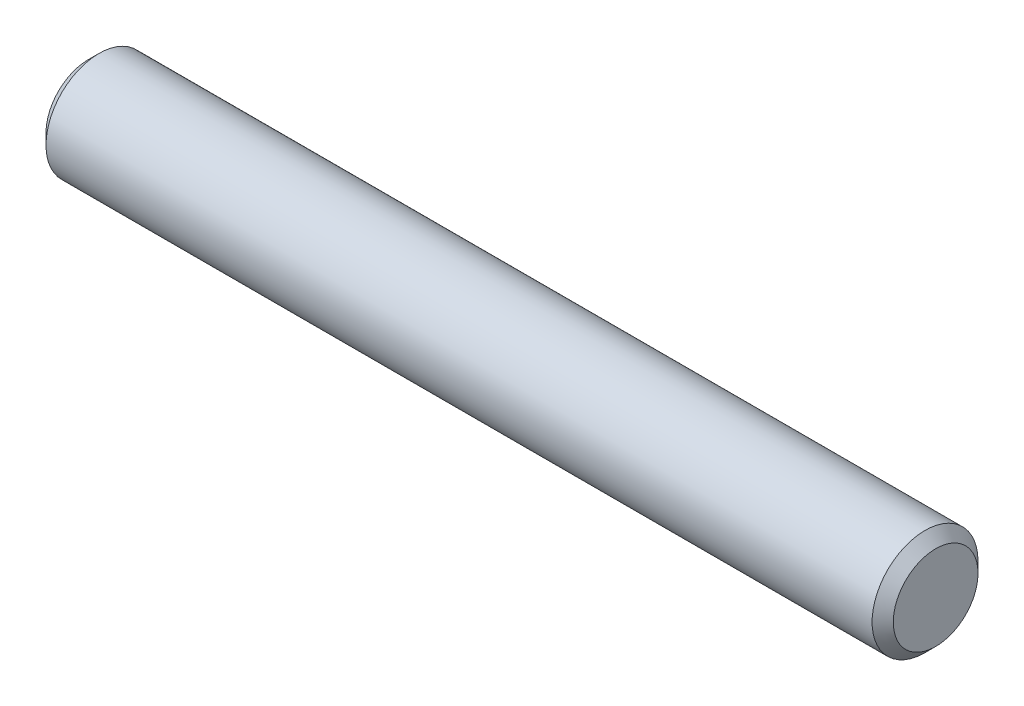
ISO-10303-21;
HEADER;
FILE_DESCRIPTION(('STEP AP214'),'2;1');
FILE_NAME('part.step','',(''),(''),'','','');
FILE_SCHEMA(('AUTOMOTIVE_DESIGN { 1 0 10303 214 1 1 1 1 }'));
ENDSEC;
DATA;
#1=APPLICATION_CONTEXT('core data for automotive mechanical design processes');
#2=APPLICATION_PROTOCOL_DEFINITION('international standard','automotive_design',2000,#1);
#3=PRODUCT_CONTEXT('',#1,'mechanical');
#4=PRODUCT('Part','Part','',(#3));
#5=PRODUCT_RELATED_PRODUCT_CATEGORY('part','',(#4));
#6=PRODUCT_DEFINITION_FORMATION('','',#4);
#7=PRODUCT_DEFINITION_CONTEXT('part definition',#1,'design');
#8=PRODUCT_DEFINITION('design','',#6,#7);
#9=PRODUCT_DEFINITION_SHAPE('','',#8);
#10=(LENGTH_UNIT() NAMED_UNIT(*) SI_UNIT(.MILLI.,.METRE.));
#11=(NAMED_UNIT(*) PLANE_ANGLE_UNIT() SI_UNIT($,.RADIAN.));
#12=(NAMED_UNIT(*) SI_UNIT($,.STERADIAN.) SOLID_ANGLE_UNIT());
#13=UNCERTAINTY_MEASURE_WITH_UNIT(LENGTH_MEASURE(1.E-05),#10,'distance_accuracy_value','');
#14=(GEOMETRIC_REPRESENTATION_CONTEXT(3) GLOBAL_UNCERTAINTY_ASSIGNED_CONTEXT((#13)) GLOBAL_UNIT_ASSIGNED_CONTEXT((#10,
#11,#12)) REPRESENTATION_CONTEXT('',''));
#15=CARTESIAN_POINT('',(0.,0.,0.));
#16=DIRECTION('',(0.,0.,1.));
#17=DIRECTION('',(1.,0.,0.));
#18=AXIS2_PLACEMENT_3D('',#15,#16,#17);
#19=CARTESIAN_POINT('',(-12.7,0.,0.));
#20=DIRECTION('',(1.,0.,0.));
#21=DIRECTION('',(0.,0.,-1.));
#22=AXIS2_PLACEMENT_3D('',#19,#20,#21);
#23=CYLINDRICAL_SURFACE('',#22,1.5875);
#24=CARTESIAN_POINT('',(12.3825,0.,0.));
#25=DIRECTION('',(1.,0.,0.));
#26=DIRECTION('',(0.,0.,-1.));
#27=AXIS2_PLACEMENT_3D('',#24,#25,#26);
#28=CIRCLE('',#27,1.5875);
#29=CARTESIAN_POINT('',(12.3825,0.,-1.5875));
#30=VERTEX_POINT('',#29);
#31=EDGE_CURVE('E41',#30,#30,#28,.F.);
#32=ORIENTED_EDGE('',*,*,#31,.T.);
#33=EDGE_LOOP('',(#32));
#34=FACE_BOUND('',#33,.T.);
#35=CARTESIAN_POINT('',(-12.3825,0.,0.));
#36=DIRECTION('',(1.,0.,0.));
#37=DIRECTION('',(0.,0.,-1.));
#38=AXIS2_PLACEMENT_3D('',#35,#36,#37);
#39=CIRCLE('',#38,1.5875);
#40=CARTESIAN_POINT('',(-12.3825,0.,-1.5875));
#41=VERTEX_POINT('',#40);
#42=EDGE_CURVE('E45',#41,#41,#39,.T.);
#43=ORIENTED_EDGE('',*,*,#42,.T.);
#44=EDGE_LOOP('',(#43));
#45=FACE_BOUND('',#44,.T.);
#46=ADVANCED_FACE('F34',(#34,#45),#23,.T.);
#47=CARTESIAN_POINT('',(-12.7,0.,0.));
#48=DIRECTION('',(1.,0.,0.));
#49=DIRECTION('',(0.,0.,-1.));
#50=AXIS2_PLACEMENT_3D('',#47,#48,#49);
#51=PLANE('',#50);
#52=CARTESIAN_POINT('',(-12.7,0.,0.));
#53=DIRECTION('',(1.,0.,0.));
#54=DIRECTION('',(0.,0.,-1.));
#55=AXIS2_PLACEMENT_3D('',#52,#53,#54);
#56=CIRCLE('',#55,1.26999999999999);
#57=CARTESIAN_POINT('',(-12.7,0.,-1.26999999999999));
#58=VERTEX_POINT('',#57);
#59=EDGE_CURVE('E10',#58,#58,#56,.F.);
#60=ORIENTED_EDGE('',*,*,#59,.T.);
#61=EDGE_LOOP('',(#60));
#62=FACE_BOUND('',#61,.T.);
#63=ADVANCED_FACE('F65',(#62),#51,.F.);
#64=CARTESIAN_POINT('',(12.7,0.,0.));
#65=DIRECTION('',(1.,0.,0.));
#66=DIRECTION('',(0.,0.,-1.));
#67=AXIS2_PLACEMENT_3D('',#64,#65,#66);
#68=PLANE('',#67);
#69=CARTESIAN_POINT('',(12.7,0.,0.));
#70=DIRECTION('',(1.,0.,0.));
#71=DIRECTION('',(0.,0.,-1.));
#72=AXIS2_PLACEMENT_3D('',#69,#70,#71);
#73=CIRCLE('',#72,1.27);
#74=CARTESIAN_POINT('',(12.7,0.,-1.27));
#75=VERTEX_POINT('',#74);
#76=EDGE_CURVE('E49',#75,#75,#73,.T.);
#77=ORIENTED_EDGE('',*,*,#76,.T.);
#78=EDGE_LOOP('',(#77));
#79=FACE_BOUND('',#78,.T.);
#80=ADVANCED_FACE('F55',(#79),#68,.T.);
#81=CARTESIAN_POINT('',(12.7,0.,0.));
#82=DIRECTION('',(-1.,0.,0.));
#83=DIRECTION('',(0.,0.,1.));
#84=AXIS2_PLACEMENT_3D('',#81,#82,#83);
#85=CONICAL_SURFACE('',#84,1.27,0.785398163397445);
#86=ORIENTED_EDGE('',*,*,#31,.F.);
#87=EDGE_LOOP('',(#86));
#88=FACE_BOUND('',#87,.T.);
#89=ORIENTED_EDGE('',*,*,#76,.F.);
#90=EDGE_LOOP('',(#89));
#91=FACE_BOUND('',#90,.T.);
#92=ADVANCED_FACE('F57',(#88,#91),#85,.T.);
#93=CARTESIAN_POINT('',(-12.3825,0.,0.));
#94=DIRECTION('',(1.,0.,0.));
#95=DIRECTION('',(0.,0.,-1.));
#96=AXIS2_PLACEMENT_3D('',#93,#94,#95);
#97=CONICAL_SURFACE('',#96,1.5875,0.78539816339745);
#98=ORIENTED_EDGE('',*,*,#59,.F.);
#99=EDGE_LOOP('',(#98));
#100=FACE_BOUND('',#99,.T.);
#101=ORIENTED_EDGE('',*,*,#42,.F.);
#102=EDGE_LOOP('',(#101));
#103=FACE_BOUND('',#102,.T.);
#104=ADVANCED_FACE('F36',(#100,#103),#97,.T.);
#105=CLOSED_SHELL('',(#46,#63,#80,#92,#104));
#106=MANIFOLD_SOLID_BREP('B2',#105);
#107=ADVANCED_BREP_SHAPE_REPRESENTATION('',(#18,#106),#14);
#108=SHAPE_DEFINITION_REPRESENTATION(#9,#107);
ENDSEC;
END-ISO-10303-21;
